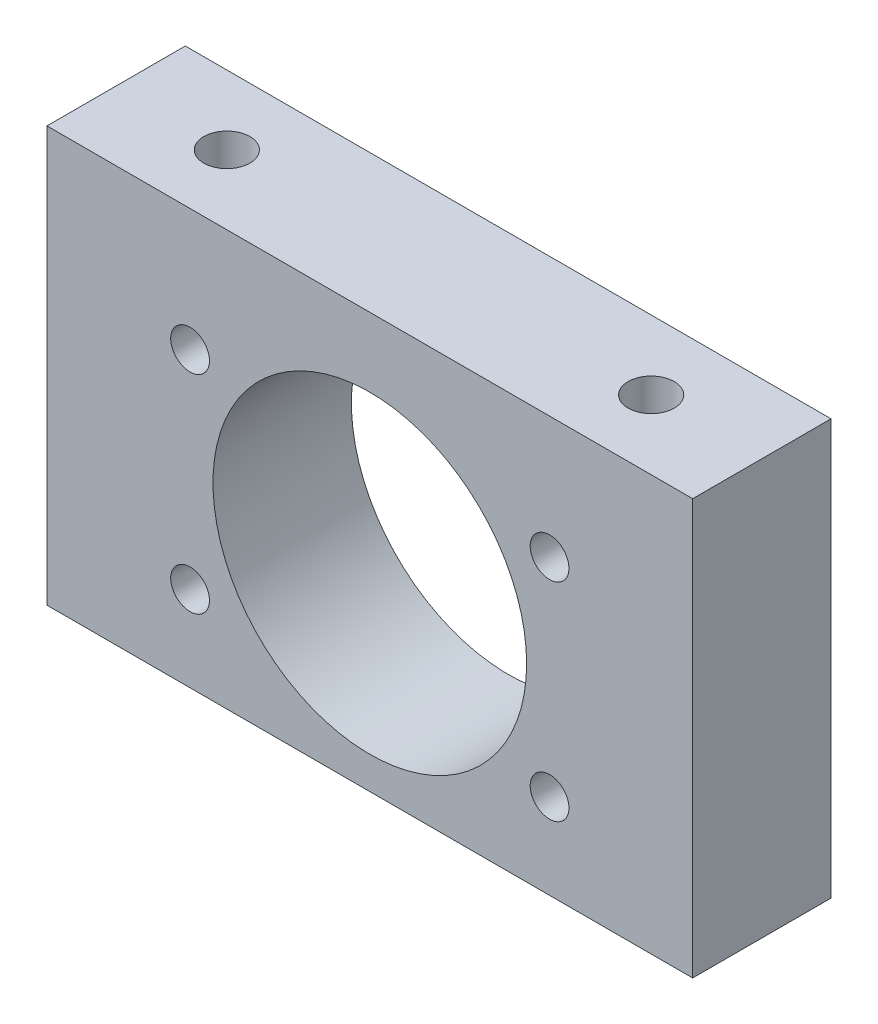
ISO-10303-21;
HEADER;
FILE_DESCRIPTION(('STEP AP214'),'2;1');
FILE_NAME('part.step','',(''),(''),'','','');
FILE_SCHEMA(('AUTOMOTIVE_DESIGN { 1 0 10303 214 1 1 1 1 }'));
ENDSEC;
DATA;
#1=APPLICATION_CONTEXT('core data for automotive mechanical design processes');
#2=APPLICATION_PROTOCOL_DEFINITION('international standard','automotive_design',2000,#1);
#3=PRODUCT_CONTEXT('',#1,'mechanical');
#4=PRODUCT('Part','Part','',(#3));
#5=PRODUCT_RELATED_PRODUCT_CATEGORY('part','',(#4));
#6=PRODUCT_DEFINITION_FORMATION('','',#4);
#7=PRODUCT_DEFINITION_CONTEXT('part definition',#1,'design');
#8=PRODUCT_DEFINITION('design','',#6,#7);
#9=PRODUCT_DEFINITION_SHAPE('','',#8);
#10=(LENGTH_UNIT() NAMED_UNIT(*) SI_UNIT(.MILLI.,.METRE.));
#11=(NAMED_UNIT(*) PLANE_ANGLE_UNIT() SI_UNIT($,.RADIAN.));
#12=(NAMED_UNIT(*) SI_UNIT($,.STERADIAN.) SOLID_ANGLE_UNIT());
#13=UNCERTAINTY_MEASURE_WITH_UNIT(LENGTH_MEASURE(1.E-05),#10,'distance_accuracy_value','');
#14=(GEOMETRIC_REPRESENTATION_CONTEXT(3) GLOBAL_UNCERTAINTY_ASSIGNED_CONTEXT((#13)) GLOBAL_UNIT_ASSIGNED_CONTEXT((#10,
#11,#12)) REPRESENTATION_CONTEXT('',''));
#15=CARTESIAN_POINT('',(0.,0.,0.));
#16=DIRECTION('',(0.,0.,1.));
#17=DIRECTION('',(1.,0.,0.));
#18=AXIS2_PLACEMENT_3D('',#15,#16,#17);
#19=CARTESIAN_POINT('',(0.,0.,15.));
#20=DIRECTION('',(1.,0.,0.));
#21=DIRECTION('',(0.,0.,-1.));
#22=AXIS2_PLACEMENT_3D('',#19,#20,#21);
#23=PLANE('',#22);
#24=DIRECTION('',(0.,-1.,0.));
#25=VECTOR('',#24,1.);
#26=CARTESIAN_POINT('',(0.,0.,0.));
#27=LINE('',#26,#25);
#28=CARTESIAN_POINT('',(0.,45.,0.));
#29=VERTEX_POINT('',#28);
#30=CARTESIAN_POINT('',(0.,0.,0.));
#31=VERTEX_POINT('',#30);
#32=EDGE_CURVE('E187',#29,#31,#27,.T.);
#33=ORIENTED_EDGE('',*,*,#32,.T.);
#34=DIRECTION('',(0.,0.,-1.));
#35=VECTOR('',#34,1.);
#36=CARTESIAN_POINT('',(0.,0.,15.));
#37=LINE('',#36,#35);
#38=CARTESIAN_POINT('',(0.,0.,15.));
#39=VERTEX_POINT('',#38);
#40=EDGE_CURVE('E190',#39,#31,#37,.T.);
#41=ORIENTED_EDGE('',*,*,#40,.F.);
#42=DIRECTION('',(0.,-1.,0.));
#43=VECTOR('',#42,1.);
#44=CARTESIAN_POINT('',(0.,0.,15.));
#45=LINE('',#44,#43);
#46=CARTESIAN_POINT('',(0.,45.,15.));
#47=VERTEX_POINT('',#46);
#48=EDGE_CURVE('E210',#47,#39,#45,.T.);
#49=ORIENTED_EDGE('',*,*,#48,.F.);
#50=DIRECTION('',(0.,0.,-1.));
#51=VECTOR('',#50,1.);
#52=CARTESIAN_POINT('',(0.,45.,15.));
#53=LINE('',#52,#51);
#54=EDGE_CURVE('E192',#47,#29,#53,.T.);
#55=ORIENTED_EDGE('',*,*,#54,.T.);
#56=EDGE_LOOP('',(#33,#41,#49,#55));
#57=FACE_BOUND('',#56,.T.);
#58=ADVANCED_FACE('F35',(#57),#23,.F.);
#59=CARTESIAN_POINT('',(0.,0.,15.));
#60=DIRECTION('',(0.,1.,0.));
#61=DIRECTION('',(0.,0.,1.));
#62=AXIS2_PLACEMENT_3D('',#59,#60,#61);
#63=PLANE('',#62);
#64=DIRECTION('',(1.,0.,0.));
#65=VECTOR('',#64,1.);
#66=CARTESIAN_POINT('',(0.,0.,0.));
#67=LINE('',#66,#65);
#68=CARTESIAN_POINT('',(70.,0.,0.));
#69=VERTEX_POINT('',#68);
#70=EDGE_CURVE('E195',#31,#69,#67,.T.);
#71=ORIENTED_EDGE('',*,*,#70,.T.);
#72=DIRECTION('',(0.,0.,-1.));
#73=VECTOR('',#72,1.);
#74=CARTESIAN_POINT('',(70.,0.,15.));
#75=LINE('',#74,#73);
#76=CARTESIAN_POINT('',(70.,0.,15.));
#77=VERTEX_POINT('',#76);
#78=EDGE_CURVE('E215',#77,#69,#75,.T.);
#79=ORIENTED_EDGE('',*,*,#78,.F.);
#80=DIRECTION('',(1.,0.,0.));
#81=VECTOR('',#80,1.);
#82=CARTESIAN_POINT('',(0.,0.,15.));
#83=LINE('',#82,#81);
#84=EDGE_CURVE('E238',#39,#77,#83,.T.);
#85=ORIENTED_EDGE('',*,*,#84,.F.);
#86=ORIENTED_EDGE('',*,*,#40,.T.);
#87=EDGE_LOOP('',(#71,#79,#85,#86));
#88=FACE_BOUND('',#87,.T.);
#89=ADVANCED_FACE('F176',(#88),#63,.F.);
#90=CARTESIAN_POINT('',(70.,0.,15.));
#91=DIRECTION('',(-1.,0.,0.));
#92=DIRECTION('',(0.,0.,1.));
#93=AXIS2_PLACEMENT_3D('',#90,#91,#92);
#94=PLANE('',#93);
#95=DIRECTION('',(0.,1.,0.));
#96=VECTOR('',#95,1.);
#97=CARTESIAN_POINT('',(70.,0.,0.));
#98=LINE('',#97,#96);
#99=CARTESIAN_POINT('',(70.,45.,0.));
#100=VERTEX_POINT('',#99);
#101=EDGE_CURVE('E198',#69,#100,#98,.T.);
#102=ORIENTED_EDGE('',*,*,#101,.T.);
#103=DIRECTION('',(0.,0.,-1.));
#104=VECTOR('',#103,1.);
#105=CARTESIAN_POINT('',(70.,45.,15.));
#106=LINE('',#105,#104);
#107=CARTESIAN_POINT('',(70.,45.,15.));
#108=VERTEX_POINT('',#107);
#109=EDGE_CURVE('E212',#108,#100,#106,.T.);
#110=ORIENTED_EDGE('',*,*,#109,.F.);
#111=DIRECTION('',(0.,1.,0.));
#112=VECTOR('',#111,1.);
#113=CARTESIAN_POINT('',(70.,0.,15.));
#114=LINE('',#113,#112);
#115=EDGE_CURVE('E239',#77,#108,#114,.T.);
#116=ORIENTED_EDGE('',*,*,#115,.F.);
#117=ORIENTED_EDGE('',*,*,#78,.T.);
#118=EDGE_LOOP('',(#102,#110,#116,#117));
#119=FACE_BOUND('',#118,.T.);
#120=ADVANCED_FACE('F181',(#119),#94,.F.);
#121=CARTESIAN_POINT('',(0.,45.,15.));
#122=DIRECTION('',(0.,-1.,0.));
#123=DIRECTION('',(0.,0.,-1.));
#124=AXIS2_PLACEMENT_3D('',#121,#122,#123);
#125=PLANE('',#124);
#126=CARTESIAN_POINT('',(12.,45.,7.49999999999999));
#127=DIRECTION('',(0.,1.,0.));
#128=DIRECTION('',(0.,0.,1.));
#129=AXIS2_PLACEMENT_3D('',#126,#127,#128);
#130=CIRCLE('',#129,2.5);
#131=CARTESIAN_POINT('',(12.,45.,9.99999999999999));
#132=VERTEX_POINT('',#131);
#133=EDGE_CURVE('E222',#132,#132,#130,.T.);
#134=ORIENTED_EDGE('',*,*,#133,.F.);
#135=EDGE_LOOP('',(#134));
#136=FACE_BOUND('',#135,.T.);
#137=CARTESIAN_POINT('',(58.,45.,7.49999999999999));
#138=DIRECTION('',(0.,1.,0.));
#139=DIRECTION('',(0.,0.,1.));
#140=AXIS2_PLACEMENT_3D('',#137,#138,#139);
#141=CIRCLE('',#140,2.5);
#142=CARTESIAN_POINT('',(58.,45.,9.99999999999999));
#143=VERTEX_POINT('',#142);
#144=EDGE_CURVE('E221',#143,#143,#141,.T.);
#145=ORIENTED_EDGE('',*,*,#144,.F.);
#146=EDGE_LOOP('',(#145));
#147=FACE_BOUND('',#146,.T.);
#148=DIRECTION('',(-1.,0.,0.));
#149=VECTOR('',#148,1.);
#150=CARTESIAN_POINT('',(0.,45.,0.));
#151=LINE('',#150,#149);
#152=EDGE_CURVE('E208',#100,#29,#151,.T.);
#153=ORIENTED_EDGE('',*,*,#152,.T.);
#154=ORIENTED_EDGE('',*,*,#54,.F.);
#155=DIRECTION('',(-1.,0.,0.));
#156=VECTOR('',#155,1.);
#157=CARTESIAN_POINT('',(0.,45.,15.));
#158=LINE('',#157,#156);
#159=EDGE_CURVE('E204',#108,#47,#158,.T.);
#160=ORIENTED_EDGE('',*,*,#159,.F.);
#161=ORIENTED_EDGE('',*,*,#109,.T.);
#162=EDGE_LOOP('',(#153,#154,#160,#161));
#163=FACE_BOUND('',#162,.T.);
#164=ADVANCED_FACE('F246',(#136,#147,#163),#125,.F.);
#165=CARTESIAN_POINT('',(0.,45.,15.));
#166=DIRECTION('',(0.,0.,-1.));
#167=DIRECTION('',(-1.,0.,0.));
#168=AXIS2_PLACEMENT_3D('',#165,#166,#167);
#169=PLANE('',#168);
#170=CARTESIAN_POINT('',(54.4855715851501,31.75,15.));
#171=DIRECTION('',(0.,0.,1.));
#172=DIRECTION('',(1.,0.,0.));
#173=AXIS2_PLACEMENT_3D('',#170,#171,#172);
#174=CIRCLE('',#173,2.1);
#175=CARTESIAN_POINT('',(56.5855715851501,31.75,15.));
#176=VERTEX_POINT('',#175);
#177=EDGE_CURVE('E116',#176,#176,#174,.T.);
#178=ORIENTED_EDGE('',*,*,#177,.F.);
#179=EDGE_LOOP('',(#178));
#180=FACE_BOUND('',#179,.T.);
#181=CARTESIAN_POINT('',(15.5144284148504,31.75,15.));
#182=DIRECTION('',(0.,0.,1.));
#183=DIRECTION('',(1.,0.,0.));
#184=AXIS2_PLACEMENT_3D('',#181,#182,#183);
#185=CIRCLE('',#184,2.1);
#186=CARTESIAN_POINT('',(17.6144284148504,31.75,15.));
#187=VERTEX_POINT('',#186);
#188=EDGE_CURVE('E118',#187,#187,#185,.T.);
#189=ORIENTED_EDGE('',*,*,#188,.F.);
#190=EDGE_LOOP('',(#189));
#191=FACE_BOUND('',#190,.T.);
#192=CARTESIAN_POINT('',(54.4855715851501,9.24999999999993,15.));
#193=DIRECTION('',(0.,0.,1.));
#194=DIRECTION('',(1.,0.,0.));
#195=AXIS2_PLACEMENT_3D('',#192,#193,#194);
#196=CIRCLE('',#195,2.1);
#197=CARTESIAN_POINT('',(56.5855715851501,9.24999999999993,15.));
#198=VERTEX_POINT('',#197);
#199=EDGE_CURVE('E155',#198,#198,#196,.T.);
#200=ORIENTED_EDGE('',*,*,#199,.F.);
#201=EDGE_LOOP('',(#200));
#202=FACE_BOUND('',#201,.T.);
#203=CARTESIAN_POINT('',(15.5144284148504,9.24999999999994,15.));
#204=DIRECTION('',(0.,0.,1.));
#205=DIRECTION('',(1.,0.,0.));
#206=AXIS2_PLACEMENT_3D('',#203,#204,#205);
#207=CIRCLE('',#206,2.1);
#208=CARTESIAN_POINT('',(17.6144284148504,9.24999999999994,15.));
#209=VERTEX_POINT('',#208);
#210=EDGE_CURVE('E411',#209,#209,#207,.T.);
#211=ORIENTED_EDGE('',*,*,#210,.F.);
#212=EDGE_LOOP('',(#211));
#213=FACE_BOUND('',#212,.T.);
#214=CARTESIAN_POINT('',(35.,20.5,15.));
#215=DIRECTION('',(0.,0.,1.));
#216=DIRECTION('',(1.,0.,0.));
#217=AXIS2_PLACEMENT_3D('',#214,#215,#216);
#218=CIRCLE('',#217,17.);
#219=CARTESIAN_POINT('',(52.,20.5,15.));
#220=VERTEX_POINT('',#219);
#221=EDGE_CURVE('E201',#220,#220,#218,.T.);
#222=ORIENTED_EDGE('',*,*,#221,.F.);
#223=EDGE_LOOP('',(#222));
#224=FACE_BOUND('',#223,.T.);
#225=ORIENTED_EDGE('',*,*,#48,.T.);
#226=ORIENTED_EDGE('',*,*,#84,.T.);
#227=ORIENTED_EDGE('',*,*,#115,.T.);
#228=ORIENTED_EDGE('',*,*,#159,.T.);
#229=EDGE_LOOP('',(#225,#226,#227,#228));
#230=FACE_BOUND('',#229,.T.);
#231=ADVANCED_FACE('F244',(#180,#191,#202,#213,#224,#230),#169,.F.);
#232=CARTESIAN_POINT('',(0.,45.,0.));
#233=DIRECTION('',(0.,0.,-1.));
#234=DIRECTION('',(-1.,0.,0.));
#235=AXIS2_PLACEMENT_3D('',#232,#233,#234);
#236=PLANE('',#235);
#237=CARTESIAN_POINT('',(35.,20.5,0.));
#238=DIRECTION('',(0.,0.,1.));
#239=DIRECTION('',(1.,0.,0.));
#240=AXIS2_PLACEMENT_3D('',#237,#238,#239);
#241=CIRCLE('',#240,17.);
#242=CARTESIAN_POINT('',(52.,20.5,0.));
#243=VERTEX_POINT('',#242);
#244=EDGE_CURVE('E196',#243,#243,#241,.T.);
#245=ORIENTED_EDGE('',*,*,#244,.T.);
#246=EDGE_LOOP('',(#245));
#247=FACE_BOUND('',#246,.T.);
#248=ORIENTED_EDGE('',*,*,#32,.F.);
#249=ORIENTED_EDGE('',*,*,#152,.F.);
#250=ORIENTED_EDGE('',*,*,#101,.F.);
#251=ORIENTED_EDGE('',*,*,#70,.F.);
#252=EDGE_LOOP('',(#248,#249,#250,#251));
#253=FACE_BOUND('',#252,.T.);
#254=ADVANCED_FACE('F248',(#247,#253),#236,.T.);
#255=CARTESIAN_POINT('',(35.,20.5,0.));
#256=DIRECTION('',(0.,0.,1.));
#257=DIRECTION('',(1.,0.,0.));
#258=AXIS2_PLACEMENT_3D('',#255,#256,#257);
#259=CYLINDRICAL_SURFACE('',#258,17.);
#260=ORIENTED_EDGE('',*,*,#244,.F.);
#261=EDGE_LOOP('',(#260));
#262=FACE_BOUND('',#261,.T.);
#263=ORIENTED_EDGE('',*,*,#221,.T.);
#264=EDGE_LOOP('',(#263));
#265=FACE_BOUND('',#264,.T.);
#266=ADVANCED_FACE('F261',(#262,#265),#259,.F.);
#267=CARTESIAN_POINT('',(58.,30.,7.49999999999999));
#268=DIRECTION('',(0.,1.,0.));
#269=DIRECTION('',(0.,0.,1.));
#270=AXIS2_PLACEMENT_3D('',#267,#268,#269);
#271=CONICAL_SURFACE('',#270,2.5,1.02974425867665);
#272=CARTESIAN_POINT('',(58.,28.4978484524311,7.49999999999999));
#273=VERTEX_POINT('',#272);
#274=VERTEX_LOOP('',#273);
#275=FACE_BOUND('',#274,.T.);
#276=CARTESIAN_POINT('',(58.,30.,7.49999999999999));
#277=DIRECTION('',(0.,1.,0.));
#278=DIRECTION('',(0.,0.,1.));
#279=AXIS2_PLACEMENT_3D('',#276,#277,#278);
#280=CIRCLE('',#279,2.5);
#281=CARTESIAN_POINT('',(55.6463902617745,30.,8.3429241959572));
#282=VERTEX_POINT('',#281);
#283=CARTESIAN_POINT('',(55.6463902617745,30.,6.65707580404279));
#284=VERTEX_POINT('',#283);
#285=EDGE_CURVE('E225',#282,#284,#280,.T.);
#286=ORIENTED_EDGE('',*,*,#285,.T.);
#287=CARTESIAN_POINT('',(56.5247346540092,31.2481893000333,3.16691846711708));
#288=CARTESIAN_POINT('',(56.5106826946843,31.1910309915306,3.27223144957305));
#289=CARTESIAN_POINT('',(56.4942506055304,31.1346680763963,3.37765367558395));
#290=CARTESIAN_POINT('',(56.4569472418074,31.024002445093,3.58878460363518));
#291=CARTESIAN_POINT('',(56.4360762813703,30.9696995834574,3.69449328488115));
#292=CARTESIAN_POINT('',(56.3901986768494,30.8635794134962,3.9063515403604));
#293=CARTESIAN_POINT('',(56.3651892479476,30.8117638093683,4.01250136423183));
#294=CARTESIAN_POINT('',(56.3115390751817,30.7112084530435,4.22533637691594));
#295=CARTESIAN_POINT('',(56.2828983800424,30.6624686595881,4.33202155852667));
#296=CARTESIAN_POINT('',(56.2227543905059,30.5687779571738,4.5458962108301));
#297=CARTESIAN_POINT('',(56.1912586553484,30.5238176171977,4.65308367623974));
#298=CARTESIAN_POINT('',(56.1262807663115,30.4381453205626,4.86856279207873));
#299=CARTESIAN_POINT('',(56.0927984482949,30.3974337157153,4.97685453313268));
#300=CARTESIAN_POINT('',(56.0251228565287,30.3208784195247,5.1947564834574));
#301=CARTESIAN_POINT('',(55.9909305747594,30.2850284021897,5.3043647733368));
#302=CARTESIAN_POINT('',(55.9233057421567,30.2186066782857,5.52538437865022));
#303=CARTESIAN_POINT('',(55.8898729839643,30.1880335156606,5.63679518740037));
#304=CARTESIAN_POINT('',(55.8428210999614,30.1474201447143,5.80118195542093));
#305=CARTESIAN_POINT('',(55.8282213993926,30.1351841456196,5.85334012583731));
#306=CARTESIAN_POINT('',(55.7997342873352,30.111917568504,5.9581155065271));
#307=CARTESIAN_POINT('',(55.7858468507937,30.1008869480702,6.01073270057876));
#308=CARTESIAN_POINT('',(55.7455083749476,30.0696080583523,6.16935418979649));
#309=CARTESIAN_POINT('',(55.7203972295957,30.0511863202394,6.27607364539102));
#310=CARTESIAN_POINT('',(55.6740401516861,30.0184131856814,6.49669287483828));
#311=CARTESIAN_POINT('',(55.6530507276536,30.0043117964712,6.61068460807968));
#312=CARTESIAN_POINT('',(55.6180070214565,29.981375618145,6.8402927434104));
#313=CARTESIAN_POINT('',(55.6039538141984,29.9725416452771,6.95590939445999));
#314=CARTESIAN_POINT('',(55.5838169700203,29.9600276242852,7.1880483733203));
#315=CARTESIAN_POINT('',(55.5777280249176,29.9563441432441,7.30457004577715));
#316=CARTESIAN_POINT('',(55.5739566646824,29.9540543908998,7.53776837854316));
#317=CARTESIAN_POINT('',(55.5762721688698,29.955446862949,7.65444499334409));
#318=CARTESIAN_POINT('',(55.5906054140037,29.9642239550863,7.91352069245029));
#319=CARTESIAN_POINT('',(55.6047007909217,29.97289365959,8.05576368443222));
#320=CARTESIAN_POINT('',(55.6437518908492,29.9981034497462,8.3379503527768));
#321=CARTESIAN_POINT('',(55.6687033193803,30.0146404234757,8.47789491566695));
#322=CARTESIAN_POINT('',(55.7087684641241,30.0429650285768,8.66858869682864));
#323=CARTESIAN_POINT('',(55.7203412322942,30.0513038629587,8.72064828880954));
#324=CARTESIAN_POINT('',(55.7445018070699,30.0691309337428,8.82432676231467));
#325=CARTESIAN_POINT('',(55.7570894537561,30.0786189891744,8.87594571186094));
#326=CARTESIAN_POINT('',(55.7966209594451,30.1091861806832,9.03206422208381));
#327=CARTESIAN_POINT('',(55.8249115990471,30.1320791839824,9.13587198009755));
#328=CARTESIAN_POINT('',(55.8836345792849,30.18254410795,9.34174416342121));
#329=CARTESIAN_POINT('',(55.914067557527,30.2101174250563,9.44380805839224));
#330=CARTESIAN_POINT('',(55.9757862809941,30.2697620411561,9.64655641888615));
#331=CARTESIAN_POINT('',(56.0070734321235,30.3018411670758,9.74723814208406));
#332=CARTESIAN_POINT('',(56.0692597107854,30.3701214861935,9.94731669655812));
#333=CARTESIAN_POINT('',(56.1001588162031,30.4063229131491,10.0467134546133));
#334=CARTESIAN_POINT('',(56.1606350012503,30.4825090279352,10.2447144281598));
#335=CARTESIAN_POINT('',(56.1902091253948,30.5225016083313,10.3433165050975));
#336=CARTESIAN_POINT('',(56.2471702487661,30.6057465937836,10.5397754777592));
#337=CARTESIAN_POINT('',(56.2745572027592,30.6489990662228,10.6376323580337));
#338=CARTESIAN_POINT('',(56.3264674852986,30.7381923291466,10.83258286293));
#339=CARTESIAN_POINT('',(56.3509974509101,30.7841265010303,10.9296777472646));
#340=CARTESIAN_POINT('',(56.39685158803,30.878349952752,11.1234840773021));
#341=CARTESIAN_POINT('',(56.4181756687167,30.9266392992601,11.2201955120664));
#342=CARTESIAN_POINT('',(56.4376875601483,30.97589198418,11.3167854082431));
#343=B_SPLINE_CURVE_WITH_KNOTS('',3,(#287,#288,#289,#290,#291,#292,#293,#294,#295,#296,#297,
#298,#299,#300,#301,#302,#303,#304,#305,#306,#307,#308,#309,#310,#311,#312,#313,#314,#315,#316,
#317,#318,#319,#320,#321,#322,#323,#324,#325,#326,#327,#328,#329,#330,#331,#332,#333,#334,#335,
#336,#337,#338,#339,#340,#341,#342),.UNSPECIFIED.,.F.,.F.,(4,2,2,2,2,2,2,2,2,2,2,2,2,2,2,2,2,2,
2,2,2,2,2,2,2,2,2,4),(0.,0.361904973918611,0.723784344897329,1.08590822591481,1.4480272484095,
1.80921403806793,2.17043071169332,2.53117275831296,2.89181510476068,3.05838171025002,
3.2249424529798,3.55823962534504,3.90822621773219,4.25826703057002,4.60807442203718,
4.95779521798275,5.38668210400796,5.81539948335972,5.97731929226745,6.13921363636969,
6.46905089975781,6.79898674829461,7.12950297574056,7.46003795464668,7.79127683298387,
8.1225225600188,8.45298273755217,8.78345227515216),.UNSPECIFIED.);
#344=EDGE_CURVE('E11',#284,#282,#343,.T.);
#345=ORIENTED_EDGE('',*,*,#344,.T.);
#346=EDGE_LOOP('',(#286,#345));
#347=FACE_BOUND('',#346,.T.);
#348=ADVANCED_FACE('F172',(#275,#347),#271,.F.);
#349=CARTESIAN_POINT('',(58.,45.,7.49999999999999));
#350=DIRECTION('',(0.,1.,0.));
#351=DIRECTION('',(0.,0.,1.));
#352=AXIS2_PLACEMENT_3D('',#349,#350,#351);
#353=CYLINDRICAL_SURFACE('',#352,2.5);
#354=ORIENTED_EDGE('',*,*,#285,.F.);
#355=CARTESIAN_POINT('',(55.6463902617745,30.,8.34292419595721));
#356=CARTESIAN_POINT('',(55.6630791001433,30.0110792131816,8.38955317319804));
#357=CARTESIAN_POINT('',(55.6810850777669,30.023358345515,8.43543461889436));
#358=CARTESIAN_POINT('',(55.7194547725428,30.0505605431524,8.52542394743995));
#359=CARTESIAN_POINT('',(55.7398198327364,30.0654851171123,8.56953080056087));
#360=CARTESIAN_POINT('',(55.7826710495553,30.0982557744871,8.65575842193369));
#361=CARTESIAN_POINT('',(55.8051629613441,30.1161098868405,8.69787331031544));
#362=CARTESIAN_POINT('',(55.8518137536535,30.1549122297359,8.77965544700928));
#363=CARTESIAN_POINT('',(55.8759722934364,30.1758598288155,8.81932319251051));
#364=CARTESIAN_POINT('',(55.9505334979864,30.2438745059405,8.93458541418534));
#365=CARTESIAN_POINT('',(56.0028497234199,30.2959902966857,9.00610103977678));
#366=CARTESIAN_POINT('',(56.1077391385114,30.4140489645769,9.13594938512807));
#367=CARTESIAN_POINT('',(56.1603113378643,30.4799563821966,9.19431513034967));
#368=CARTESIAN_POINT('',(56.2570215249573,30.6192477315236,9.29345243188869));
#369=CARTESIAN_POINT('',(56.301496650789,30.6916904433394,9.3352201809891));
#370=CARTESIAN_POINT('',(56.382997903955,30.8459075856895,9.40742910407901));
#371=CARTESIAN_POINT('',(56.4200173898963,30.9276902354106,9.43786019983813));
#372=CARTESIAN_POINT('',(56.4831256110043,31.0960367936096,9.48763051184369));
#373=CARTESIAN_POINT('',(56.5094596140038,31.1824347743618,9.50722288156735));
#374=CARTESIAN_POINT('',(56.5509224337948,31.3593766206719,9.53735945727443));
#375=CARTESIAN_POINT('',(56.5660516843384,31.4499203255987,9.54790401351416));
#376=CARTESIAN_POINT('',(56.5846518578863,31.6362115756846,9.56080749130401));
#377=CARTESIAN_POINT('',(56.5876659536265,31.7320271392003,9.56284577087216));
#378=CARTESIAN_POINT('',(56.5806162793737,31.9229686330731,9.55800056055726));
#379=CARTESIAN_POINT('',(56.5705495614273,32.0180944031162,9.55111505957013));
#380=CARTESIAN_POINT('',(56.5375972265776,32.2066148467167,9.52775550698444));
#381=CARTESIAN_POINT('',(56.5144948160612,32.2999518892292,9.51111910414508));
#382=CARTESIAN_POINT('',(56.456760897151,32.4803213823777,9.46716042998792));
#383=CARTESIAN_POINT('',(56.4221334894459,32.5673560620542,9.43984195883419));
#384=CARTESIAN_POINT('',(56.3448432352196,32.7303238244675,9.3742848052982));
#385=CARTESIAN_POINT('',(56.3024071274657,32.8064829398924,9.3363414960305));
#386=CARTESIAN_POINT('',(56.2122722081561,32.9481459527682,9.24870242019299));
#387=CARTESIAN_POINT('',(56.1645753804448,33.0136538439489,9.19901107583809));
#388=CARTESIAN_POINT('',(56.0693712194113,33.1309857456757,9.08988657948618));
#389=CARTESIAN_POINT('',(56.0219049254263,33.1831747132773,9.03080814106018));
#390=CARTESIAN_POINT('',(55.9292507064774,33.276474883542,8.90293678352434));
#391=CARTESIAN_POINT('',(55.8840634826692,33.317582693784,8.83414089928568));
#392=CARTESIAN_POINT('',(55.7969958288223,33.3912117957209,8.68513795731653));
#393=CARTESIAN_POINT('',(55.7553609359794,33.4232547578093,8.60455305840324));
#394=CARTESIAN_POINT('',(55.6802523465767,33.477684389308,8.43661668248966));
#395=CARTESIAN_POINT('',(55.6467828048138,33.5000661472201,8.34926179035922));
#396=CARTESIAN_POINT('',(55.5859286720176,33.5390481927855,8.15841894526017));
#397=CARTESIAN_POINT('',(55.5598540208985,33.5545553445296,8.05428993095641));
#398=CARTESIAN_POINT('',(55.5212518960999,33.5769811350841,7.84263872903644));
#399=CARTESIAN_POINT('',(55.5087317671117,33.5838951178759,7.735114734248));
#400=CARTESIAN_POINT('',(55.4971456081812,33.5903203944636,7.50752378894653));
#401=CARTESIAN_POINT('',(55.4996678495553,33.5889575025284,7.38734925965005));
#402=CARTESIAN_POINT('',(55.5218785225255,33.5765365590956,7.14897040788802));
#403=CARTESIAN_POINT('',(55.5415751647954,33.5654738703409,7.03076705534527));
#404=CARTESIAN_POINT('',(55.5834663018259,33.5402178508252,6.85652906757059));
#405=CARTESIAN_POINT('',(55.5997203379295,33.5302065764086,6.79838125933901));
#406=CARTESIAN_POINT('',(55.63615455185,33.5068812419805,6.68401802165461));
#407=CARTESIAN_POINT('',(55.6563329245726,33.4935686996961,6.62780171769522));
#408=CARTESIAN_POINT('',(55.7002483882269,33.463262923373,6.51783507774355));
#409=CARTESIAN_POINT('',(55.7239837463397,33.446271479763,6.46408355756899));
#410=CARTESIAN_POINT('',(55.7745230984945,33.4081931359184,6.35955264594312));
#411=CARTESIAN_POINT('',(55.8013266645368,33.387106806615,6.30877284144201));
#412=CARTESIAN_POINT('',(55.8549708117543,33.3424374610809,6.21488487412797));
#413=CARTESIAN_POINT('',(55.8816150329779,33.3192184265524,6.17149141379662));
#414=CARTESIAN_POINT('',(55.9363198241074,33.2687869318265,6.08801024820701));
#415=CARTESIAN_POINT('',(55.9643808767349,33.2415731044772,6.04792368204423));
#416=CARTESIAN_POINT('',(56.0211497980539,33.1830581518647,5.9714663060578));
#417=CARTESIAN_POINT('',(56.049856654306,33.1517630993498,5.93509011584845));
#418=CARTESIAN_POINT('',(56.107166309948,33.085054385307,5.86623398512623));
#419=CARTESIAN_POINT('',(56.1357690760162,33.0496395072221,5.83375520127265));
#420=CARTESIAN_POINT('',(56.2124287550225,32.9476830437989,5.7508050661316));
#421=CARTESIAN_POINT('',(56.259598467363,32.8771501987886,5.70430408409597));
#422=CARTESIAN_POINT('',(56.3471647566883,32.7257684458409,5.6233745536043));
#423=CARTESIAN_POINT('',(56.3875607512283,32.644918651842,5.58894704301995));
#424=CARTESIAN_POINT('',(56.4568368856123,32.4792480263478,5.53262830542317));
#425=CARTESIAN_POINT('',(56.4861639419141,32.3947848556739,5.51023005495183));
#426=CARTESIAN_POINT('',(56.5340542598994,32.2210069667422,5.47468583147919));
#427=CARTESIAN_POINT('',(56.5526161663603,32.1316916391946,5.46154102334745));
#428=CARTESIAN_POINT('',(56.5784054474392,31.947463938672,5.44346647068318));
#429=CARTESIAN_POINT('',(56.5852214019895,31.8524646999455,5.4388345516372));
#430=CARTESIAN_POINT('',(56.5858955085886,31.662387308871,5.4383726490535));
#431=CARTESIAN_POINT('',(56.579751312516,31.5673091453431,5.44254426054036));
#432=CARTESIAN_POINT('',(56.5545371258878,31.3775098982923,5.46017647056294));
#433=CARTESIAN_POINT('',(56.5351746717497,31.2828467345112,5.47384737259369));
#434=CARTESIAN_POINT('',(56.4843830945373,31.0989675647993,5.51155873765185));
#435=CARTESIAN_POINT('',(56.4529552711976,31.0097509733392,5.53559808377927));
#436=CARTESIAN_POINT('',(56.3809153277089,30.8412068385989,5.59456652565834));
#437=CARTESIAN_POINT('',(56.3404947122254,30.761720100195,5.62927360721669));
#438=CARTESIAN_POINT('',(56.2532594010455,30.6130293350713,5.7104683412076));
#439=CARTESIAN_POINT('',(56.2064511016986,30.5438151647825,5.75694424818587));
#440=CARTESIAN_POINT('',(56.1120362349506,30.419396693668,5.85979229505964));
#441=CARTESIAN_POINT('',(56.0645193464322,30.3637771385771,5.91574705611625));
#442=CARTESIAN_POINT('',(55.9706595921802,30.2636482562411,6.03791187613169));
#443=CARTESIAN_POINT('',(55.9243189087979,30.2191583928041,6.10413957751831));
#444=CARTESIAN_POINT('',(55.8575183320545,30.1598147390871,6.21095939067307));
#445=CARTESIAN_POINT('',(55.8353959641479,30.1410449438667,6.24842818181014));
#446=CARTESIAN_POINT('',(55.7926685006071,30.1061456187567,6.32542679488378));
#447=CARTESIAN_POINT('',(55.7720636846156,30.0900165748179,6.36495699439974));
#448=CARTESIAN_POINT('',(55.7327315432646,30.0602659381754,6.44572026307687));
#449=CARTESIAN_POINT('',(55.7140000374599,30.0466387029407,6.48694923693758));
#450=CARTESIAN_POINT('',(55.6785970328505,30.0216618597817,6.5709286673878));
#451=CARTESIAN_POINT('',(55.6619245425711,30.0103111539873,6.61367837882429));
#452=CARTESIAN_POINT('',(55.6463902617745,30.,6.65707580404278));
#453=B_SPLINE_CURVE_WITH_KNOTS('',3,(#355,#356,#357,#358,#359,#360,#361,#362,#363,#364,#365,
#366,#367,#368,#369,#370,#371,#372,#373,#374,#375,#376,#377,#378,#379,#380,#381,#382,#383,#384,
#385,#386,#387,#388,#389,#390,#391,#392,#393,#394,#395,#396,#397,#398,#399,#400,#401,#402,#403,
#404,#405,#406,#407,#408,#409,#410,#411,#412,#413,#414,#415,#416,#417,#418,#419,#420,#421,#422,
#423,#424,#425,#426,#427,#428,#429,#430,#431,#432,#433,#434,#435,#436,#437,#438,#439,#440,#441,
#442,#443,#444,#445,#446,#447,#448,#449,#450,#451,#452),.UNSPECIFIED.,.F.,.F.,(4,2,2,2,2,2,2,2,
2,2,2,2,2,2,2,2,2,2,2,2,2,2,2,2,2,2,2,2,2,2,2,2,2,2,2,2,2,2,2,2,2,2,2,2,2,2,2,2,4),(0.,
0.152224342220604,0.30453577666436,0.457271843474789,0.609976775804813,0.916566757422442,
1.22237794617077,1.50508189467771,1.78803656926841,2.06406861754423,2.34008997966609,
2.62642684950832,2.91282826076201,3.20413939768233,3.4953469943168,3.77914904691927,
4.06284443989519,4.33763561050392,4.61251081126644,4.89994942219567,5.18753398763588,
5.51158894960195,5.83581941714673,6.19484982949909,6.55405197994913,6.73745366418356,
6.92077118702121,7.10399969357329,7.28720267173008,7.45485103847552,7.62255691445491,
7.79001603686612,7.95752473496631,8.2461502771403,8.53480062435034,8.81007424846324,
9.08538251920146,9.37015149968655,9.65497207907519,9.94630795354763,10.2376124528401,
10.5232236313168,10.8085508815508,11.0835873582781,11.359101513232,11.5011472446899,
11.643219086077,11.7849664556898,11.9266453015315),.UNSPECIFIED.);
#454=EDGE_CURVE('E53',#282,#284,#453,.T.);
#455=ORIENTED_EDGE('',*,*,#454,.T.);
#456=EDGE_LOOP('',(#354,#455));
#457=FACE_BOUND('',#456,.T.);
#458=ORIENTED_EDGE('',*,*,#144,.T.);
#459=EDGE_LOOP('',(#458));
#460=FACE_BOUND('',#459,.T.);
#461=ADVANCED_FACE('F128',(#457,#460),#353,.F.);
#462=CARTESIAN_POINT('',(12.,30.,7.49999999999999));
#463=DIRECTION('',(0.,1.,0.));
#464=DIRECTION('',(0.,0.,1.));
#465=AXIS2_PLACEMENT_3D('',#462,#463,#464);
#466=CONICAL_SURFACE('',#465,2.5,1.02974425867665);
#467=CARTESIAN_POINT('',(12.,28.4978484524311,7.49999999999999));
#468=VERTEX_POINT('',#467);
#469=VERTEX_LOOP('',#468);
#470=FACE_BOUND('',#469,.T.);
#471=CARTESIAN_POINT('',(12.,30.,7.49999999999999));
#472=DIRECTION('',(0.,1.,0.));
#473=DIRECTION('',(0.,0.,1.));
#474=AXIS2_PLACEMENT_3D('',#471,#472,#473);
#475=CIRCLE('',#474,2.5);
#476=CARTESIAN_POINT('',(14.353609738226,30.,6.65707580404418));
#477=VERTEX_POINT('',#476);
#478=CARTESIAN_POINT('',(14.353609738226,30.,8.3429241959558));
#479=VERTEX_POINT('',#478);
#480=EDGE_CURVE('E219',#477,#479,#475,.T.);
#481=ORIENTED_EDGE('',*,*,#480,.T.);
#482=CARTESIAN_POINT('',(13.562312439852,30.9758919841806,11.316785408244));
#483=CARTESIAN_POINT('',(13.5839057864947,30.9213632807148,11.2098397609063));
#484=CARTESIAN_POINT('',(13.6077339696277,30.8680120969539,11.1027506781003));
#485=CARTESIAN_POINT('',(13.6592659363611,30.7642533158289,10.8880855557671));
#486=CARTESIAN_POINT('',(13.6869695465735,30.7138455869163,10.780509538234));
#487=CARTESIAN_POINT('',(13.745786020442,30.6163489344677,10.5641986854165));
#488=CARTESIAN_POINT('',(13.7769129778975,30.5692751502532,10.4554608602875));
#489=CARTESIAN_POINT('',(13.8415723297973,30.4793240090038,10.2369705511573));
#490=CARTESIAN_POINT('',(13.8751046826476,30.4364465794357,10.1272180847298));
#491=CARTESIAN_POINT('',(13.9441733598552,30.3545673662539,9.90377496884262));
#492=CARTESIAN_POINT('',(13.979738061663,30.3156777192729,9.79005186026147));
#493=CARTESIAN_POINT('',(14.0505310723151,30.2434938547213,9.56071335211987));
#494=CARTESIAN_POINT('',(14.085759343022,30.2102002645734,9.44509774196722));
#495=CARTESIAN_POINT('',(14.1538667251346,30.1497055068557,9.21197628528185));
#496=CARTESIAN_POINT('',(14.1867524488696,30.1224866869841,9.09447700774116));
#497=CARTESIAN_POINT('',(14.2482155804774,30.0742208797029,8.85713230673678));
#498=CARTESIAN_POINT('',(14.2767947410753,30.0531713781326,8.73728786029193));
#499=CARTESIAN_POINT('',(14.3260535463877,30.0183470740793,8.50286332629308));
#500=CARTESIAN_POINT('',(14.3471141256489,30.0042010586227,8.38841979417782));
#501=CARTESIAN_POINT('',(14.3822433730792,29.9812146374716,8.15788005370627));
#502=CARTESIAN_POINT('',(14.3963099116606,29.9723758475833,8.04178335303813));
#503=CARTESIAN_POINT('',(14.4163210048547,29.9599438620718,7.80961729576007));
#504=CARTESIAN_POINT('',(14.422335073546,29.9563057521049,7.69355646776243));
#505=CARTESIAN_POINT('',(14.4260252796682,29.9540654206593,7.46129383911406));
#506=CARTESIAN_POINT('',(14.4237037990738,29.9554617605319,7.34509208822053));
#507=CARTESIAN_POINT('',(14.4094013487081,29.9642195908522,7.08663664033139));
#508=CARTESIAN_POINT('',(14.3953222754421,29.9728787208404,6.94453560503829));
#509=CARTESIAN_POINT('',(14.3660736296971,29.9917605476228,6.73298337498463));
#510=CARTESIAN_POINT('',(14.3549528887005,29.9990475874212,6.66265850061234));
#511=CARTESIAN_POINT('',(14.3303050330984,30.015619693949,6.52266284167991));
#512=CARTESIAN_POINT('',(14.3167778485159,30.0249048187823,6.45299207620264));
#513=CARTESIAN_POINT('',(14.2828225609531,30.0489097262017,6.29140035905145));
#514=CARTESIAN_POINT('',(14.2615936765301,30.0644106157359,6.19976368542837));
#515=CARTESIAN_POINT('',(14.2163468641912,30.0990003939327,6.01785827914282));
#516=CARTESIAN_POINT('',(14.192328273726,30.1180901356089,5.92758987722039));
#517=CARTESIAN_POINT('',(14.1174381914428,30.1807276340969,5.6586430977431));
#518=CARTESIAN_POINT('',(14.0637680867897,30.2296205320552,5.48197835111159));
#519=CARTESIAN_POINT('',(13.9557492364608,30.340554245962,5.1324485018333));
#520=CARTESIAN_POINT('',(13.9013988336754,30.4026379991785,4.95959789348546));
#521=CARTESIAN_POINT('',(13.7976053932194,30.5376585729157,4.61679688416748));
#522=CARTESIAN_POINT('',(13.7481595824095,30.6105892014459,4.44684488980917));
#523=CARTESIAN_POINT('',(13.6779272810132,30.7303322268892,4.18433736879235));
#524=CARTESIAN_POINT('',(13.6542229019333,30.7742143552354,4.09120637333589));
#525=CARTESIAN_POINT('',(13.6097446385188,30.8641711196938,3.90530214417261));
#526=CARTESIAN_POINT('',(13.5889706810997,30.9102457010881,3.81252890159963));
#527=CARTESIAN_POINT('',(13.550707137309,31.0041040745815,3.6274953789745));
#528=CARTESIAN_POINT('',(13.5332088436718,31.0518829215409,3.53523439027563));
#529=CARTESIAN_POINT('',(13.5016262642444,31.1489671646527,3.35092599622837));
#530=CARTESIAN_POINT('',(13.4875421455265,31.1982726353773,3.25887860155041));
#531=CARTESIAN_POINT('',(13.4752653459912,31.2481893000336,3.16691846711674));
#532=B_SPLINE_CURVE_WITH_KNOTS('',3,(#482,#483,#484,#485,#486,#487,#488,#489,#490,#491,#492,
#493,#494,#495,#496,#497,#498,#499,#500,#501,#502,#503,#504,#505,#506,#507,#508,#509,#510,#511,
#512,#513,#514,#515,#516,#517,#518,#519,#520,#521,#522,#523,#524,#525,#526,#527,#528,#529,#530,
#531),.UNSPECIFIED.,.F.,.F.,(4,2,2,2,2,2,2,2,2,2,2,2,2,2,2,2,2,2,2,2,2,2,2,2,4),(0.,
0.365881975947816,0.731747587436555,1.09918022029433,1.46660650103455,1.84250334551206,
2.21844230697731,2.59327420001807,2.9679531260495,3.31931383627707,3.67078146551508,
4.01919500667492,4.36750899277257,4.7959038705649,5.01055887469578,5.22522012180134,
5.51107686018389,5.79700162830525,6.36933206503748,6.94355483294136,7.51745105235062,
7.83433297383951,8.15120699092628,8.46722635657682,8.7832611834956),.UNSPECIFIED.);
#533=EDGE_CURVE('E47',#479,#477,#532,.T.);
#534=ORIENTED_EDGE('',*,*,#533,.T.);
#535=EDGE_LOOP('',(#481,#534));
#536=FACE_BOUND('',#535,.T.);
#537=ADVANCED_FACE('F163',(#470,#536),#466,.F.);
#538=CARTESIAN_POINT('',(12.,45.,7.49999999999999));
#539=DIRECTION('',(0.,1.,0.));
#540=DIRECTION('',(0.,0.,1.));
#541=AXIS2_PLACEMENT_3D('',#538,#539,#540);
#542=CYLINDRICAL_SURFACE('',#541,2.5);
#543=ORIENTED_EDGE('',*,*,#480,.F.);
#544=CARTESIAN_POINT('',(14.353609738226,30.,6.65707580404418));
#545=CARTESIAN_POINT('',(14.3369208998573,30.0110792131816,6.61044682680332));
#546=CARTESIAN_POINT('',(14.3189149222336,30.023358345515,6.56456538110698));
#547=CARTESIAN_POINT('',(14.2805452274578,30.0505605431524,6.47457605256136));
#548=CARTESIAN_POINT('',(14.2601801672642,30.0654851171122,6.43046919944041));
#549=CARTESIAN_POINT('',(14.2173289504453,30.098255774487,6.34424157806755));
#550=CARTESIAN_POINT('',(14.1948370386566,30.1161098868403,6.30212668968577));
#551=CARTESIAN_POINT('',(14.1481862463472,30.1549122297357,6.22034455299188));
#552=CARTESIAN_POINT('',(14.1240277065643,30.1758598288154,6.18067680749062));
#553=CARTESIAN_POINT('',(14.0494665020144,30.2438745059403,6.06541458581572));
#554=CARTESIAN_POINT('',(13.9971502765809,30.2959902966854,5.99389896022423));
#555=CARTESIAN_POINT('',(13.8922608614894,30.4140489645766,5.86405061487283));
#556=CARTESIAN_POINT('',(13.8396886621365,30.4799563821963,5.80568486965117));
#557=CARTESIAN_POINT('',(13.7429784750435,30.6192477315232,5.70654756811204));
#558=CARTESIAN_POINT('',(13.6985033492117,30.691690443339,5.66477981901159));
#559=CARTESIAN_POINT('',(13.6170020960458,30.845907585689,5.5925708959216));
#560=CARTESIAN_POINT('',(13.5799826101044,30.9276902354101,5.56213980016244));
#561=CARTESIAN_POINT('',(13.5168743889964,31.096036793609,5.51236948815682));
#562=CARTESIAN_POINT('',(13.4905403859969,31.1824347743612,5.49277711843313));
#563=CARTESIAN_POINT('',(13.4490775662058,31.3593766206712,5.46264054272599));
#564=CARTESIAN_POINT('',(13.4339483156622,31.449920325598,5.45209598648624));
#565=CARTESIAN_POINT('',(13.4153481421142,31.6362115756839,5.43919250869635));
#566=CARTESIAN_POINT('',(13.412334046374,31.7320271391995,5.43715422912817));
#567=CARTESIAN_POINT('',(13.4193837206268,31.9229686330723,5.44199943944303));
#568=CARTESIAN_POINT('',(13.4294504385731,32.0180944031155,5.44888494043014));
#569=CARTESIAN_POINT('',(13.4624027734228,32.2066148467159,5.47224449301579));
#570=CARTESIAN_POINT('',(13.4855051839391,32.2999518892284,5.48888089585512));
#571=CARTESIAN_POINT('',(13.5432391028492,32.4803213823769,5.53283957001223));
#572=CARTESIAN_POINT('',(13.5778665105543,32.5673560620534,5.56015804116594));
#573=CARTESIAN_POINT('',(13.6551567647805,32.7303238244668,5.62571519470187));
#574=CARTESIAN_POINT('',(13.6975928725344,32.8064829398917,5.66365850396955));
#575=CARTESIAN_POINT('',(13.7877277918439,32.9481459527675,5.75129757980702));
#576=CARTESIAN_POINT('',(13.8354246195552,33.0136538439482,5.80098892416188));
#577=CARTESIAN_POINT('',(13.9306287805887,33.1309857456751,5.91011342051375));
#578=CARTESIAN_POINT('',(13.9780950745736,33.1831747132767,5.96919185893972));
#579=CARTESIAN_POINT('',(14.0707492935225,33.2764748835415,6.09706321647551));
#580=CARTESIAN_POINT('',(14.1159365173307,33.3175826937835,6.16585910071416));
#581=CARTESIAN_POINT('',(14.2030041711776,33.3912117957204,6.31486204268325));
#582=CARTESIAN_POINT('',(14.2446390640205,33.4232547578088,6.39544694159652));
#583=CARTESIAN_POINT('',(14.3197476534232,33.4776843893076,6.56338331751004));
#584=CARTESIAN_POINT('',(14.3532171951861,33.5000661472197,6.65073820964045));
#585=CARTESIAN_POINT('',(14.4140713279823,33.5390481927851,6.84158105473944));
#586=CARTESIAN_POINT('',(14.4401459791014,33.5545553445292,6.94571006904317));
#587=CARTESIAN_POINT('',(14.4787481039001,33.5769811350838,7.15736127096307));
#588=CARTESIAN_POINT('',(14.4912682328882,33.5838951178756,7.26488526575148));
#589=CARTESIAN_POINT('',(14.5028543918188,33.5903203944633,7.4924762110529));
#590=CARTESIAN_POINT('',(14.5003321504447,33.5889575025281,7.61265074034935));
#591=CARTESIAN_POINT('',(14.4781214774746,33.5765365590954,7.85102959211135));
#592=CARTESIAN_POINT('',(14.4584248352047,33.5654738703407,7.96923294465407));
#593=CARTESIAN_POINT('',(14.4165336981743,33.540217850825,8.14347093242874));
#594=CARTESIAN_POINT('',(14.4002796620707,33.5302065764084,8.20161874066032));
#595=CARTESIAN_POINT('',(14.3638454481502,33.5068812419804,8.31598197834472));
#596=CARTESIAN_POINT('',(14.3436670754276,33.493568699696,8.3721982823041));
#597=CARTESIAN_POINT('',(14.2997516117733,33.4632629233729,8.48216492225578));
#598=CARTESIAN_POINT('',(14.2760162536606,33.4462714797628,8.53591644243033));
#599=CARTESIAN_POINT('',(14.2254769015059,33.4081931359182,8.64044735405622));
#600=CARTESIAN_POINT('',(14.1986733354636,33.3871068066149,8.69122715855733));
#601=CARTESIAN_POINT('',(14.1450291882461,33.3424374610808,8.78511512587138));
#602=CARTESIAN_POINT('',(14.1183849670225,33.3192184265523,8.82850858620274));
#603=CARTESIAN_POINT('',(14.063680175893,33.2687869318264,8.91198975179236));
#604=CARTESIAN_POINT('',(14.0356191232655,33.2415731044772,8.95207631795516));
#605=CARTESIAN_POINT('',(13.9788502019466,33.1830581518646,9.0285336939416));
#606=CARTESIAN_POINT('',(13.9501433456945,33.1517630993498,9.06490988415097));
#607=CARTESIAN_POINT('',(13.8928336900525,33.085054385307,9.1337660148732));
#608=CARTESIAN_POINT('',(13.8642309239843,33.0496395072221,9.1662447987268));
#609=CARTESIAN_POINT('',(13.787571244978,32.9476830437989,9.24919493386788));
#610=CARTESIAN_POINT('',(13.7404015326375,32.8771501987886,9.29569591590353));
#611=CARTESIAN_POINT('',(13.6528352433122,32.7257684458409,9.37662544639524));
#612=CARTESIAN_POINT('',(13.6124392487722,32.644918651842,9.4110529569796));
#613=CARTESIAN_POINT('',(13.5431631143882,32.4792480263478,9.46737169457641));
#614=CARTESIAN_POINT('',(13.5138360580864,32.3947848556739,9.48976994504776));
#615=CARTESIAN_POINT('',(13.4659457401011,32.2210069667423,9.52531416852042));
#616=CARTESIAN_POINT('',(13.4473838336403,32.1316916391947,9.53845897665217));
#617=CARTESIAN_POINT('',(13.4215945525613,31.9474639386721,9.55653352931645));
#618=CARTESIAN_POINT('',(13.414778598011,31.8524646999457,9.56116544836243));
#619=CARTESIAN_POINT('',(13.4141044914119,31.6623873088712,9.56162735094615));
#620=CARTESIAN_POINT('',(13.4202486874845,31.5673091453433,9.55745573945929));
#621=CARTESIAN_POINT('',(13.4454628741127,31.3775098982925,9.53982352943672));
#622=CARTESIAN_POINT('',(13.4648253282507,31.2828467345114,9.52615262740597));
#623=CARTESIAN_POINT('',(13.5156169054631,31.0989675647996,9.48844126234782));
#624=CARTESIAN_POINT('',(13.5470447288028,31.0097509733395,9.4644019162204));
#625=CARTESIAN_POINT('',(13.6190846722915,30.8412068385992,9.40543347434134));
#626=CARTESIAN_POINT('',(13.6595052877749,30.7617201001952,9.37072639278299));
#627=CARTESIAN_POINT('',(13.7467405989548,30.6130293350716,9.28953165879209));
#628=CARTESIAN_POINT('',(13.7935488983017,30.5438151647828,9.24305575181383));
#629=CARTESIAN_POINT('',(13.8879637650497,30.4193966936683,9.14020770494006));
#630=CARTESIAN_POINT('',(13.9354806535681,30.3637771385774,9.08425294388345));
#631=CARTESIAN_POINT('',(14.02934040782,30.2636482562414,8.96208812386802));
#632=CARTESIAN_POINT('',(14.0756810912023,30.2191583928044,8.89586042248141));
#633=CARTESIAN_POINT('',(14.1424816679457,30.1598147390874,8.78904060932657));
#634=CARTESIAN_POINT('',(14.1646040358523,30.1410449438669,8.75157181818941));
#635=CARTESIAN_POINT('',(14.2073314993932,30.1061456187568,8.6745732051156));
#636=CARTESIAN_POINT('',(14.2279363153848,30.090016574818,8.63504300559955));
#637=CARTESIAN_POINT('',(14.2672684567358,30.0602659381754,8.55427973692223));
#638=CARTESIAN_POINT('',(14.2859999625406,30.0466387029407,8.51305076306142));
#639=CARTESIAN_POINT('',(14.32140296715,30.0216618597817,8.429071332611));
#640=CARTESIAN_POINT('',(14.3380754574294,30.0103111539874,8.3863216211744));
#641=CARTESIAN_POINT('',(14.353609738226,30.,8.34292419595581));
#642=B_SPLINE_CURVE_WITH_KNOTS('',3,(#544,#545,#546,#547,#548,#549,#550,#551,#552,#553,#554,
#555,#556,#557,#558,#559,#560,#561,#562,#563,#564,#565,#566,#567,#568,#569,#570,#571,#572,#573,
#574,#575,#576,#577,#578,#579,#580,#581,#582,#583,#584,#585,#586,#587,#588,#589,#590,#591,#592,
#593,#594,#595,#596,#597,#598,#599,#600,#601,#602,#603,#604,#605,#606,#607,#608,#609,#610,#611,
#612,#613,#614,#615,#616,#617,#618,#619,#620,#621,#622,#623,#624,#625,#626,#627,#628,#629,#630,
#631,#632,#633,#634,#635,#636,#637,#638,#639,#640,#641),.UNSPECIFIED.,.F.,.F.,(4,2,2,2,2,2,2,2,
2,2,2,2,2,2,2,2,2,2,2,2,2,2,2,2,2,2,2,2,2,2,2,2,2,2,2,2,2,2,2,2,2,2,2,2,2,2,2,2,4),(0.,
0.15222434222062,0.304535776664391,0.457271843474837,0.609976775804881,0.91656675742254,
1.22237794617091,1.50508189467786,1.78803656926858,2.06406861754435,2.34008997966617,
2.62642684950835,2.91282826076197,3.20413939768224,3.49534699431667,3.7791490469191,
4.062844439895,4.33763561050371,4.61251081126619,4.89994942219536,5.18753398763551,
5.51158894960151,5.83581941714621,6.19484982949849,6.55405197994846,6.73745366418286,
6.9207711870205,7.10399969357255,7.28720267172932,7.45485103847475,7.62255691445412,
7.79001603686533,7.95752473496553,8.24615027713951,8.53480062434954,8.81007424846242,
9.0853825192006,9.37015149968564,9.65497207907424,9.94630795354661,10.237612452839,
10.5232236313157,10.8085508815497,11.0835873582769,11.3591015132308,11.501147244689,
11.6432190860764,11.7849664556895,11.9266453015315),.UNSPECIFIED.);
#643=EDGE_CURVE('E59',#477,#479,#642,.T.);
#644=ORIENTED_EDGE('',*,*,#643,.T.);
#645=EDGE_LOOP('',(#543,#644));
#646=FACE_BOUND('',#645,.T.);
#647=ORIENTED_EDGE('',*,*,#133,.T.);
#648=EDGE_LOOP('',(#647));
#649=FACE_BOUND('',#648,.T.);
#650=ADVANCED_FACE('F158',(#646,#649),#542,.F.);
#651=CARTESIAN_POINT('',(15.5144284148504,9.24999999999994,2.6));
#652=DIRECTION('',(0.,0.,1.));
#653=DIRECTION('',(1.,0.,0.));
#654=AXIS2_PLACEMENT_3D('',#651,#652,#653);
#655=CONICAL_SURFACE('',#654,2.1,1.02974425867665);
#656=CARTESIAN_POINT('',(15.5144284148504,9.24999999999994,1.33819270004212));
#657=VERTEX_POINT('',#656);
#658=VERTEX_LOOP('',#657);
#659=FACE_BOUND('',#658,.T.);
#660=CARTESIAN_POINT('',(15.5144284148504,9.24999999999994,2.6));
#661=DIRECTION('',(0.,0.,1.));
#662=DIRECTION('',(1.,0.,0.));
#663=AXIS2_PLACEMENT_3D('',#660,#661,#662);
#664=CIRCLE('',#663,2.1);
#665=CARTESIAN_POINT('',(17.6144284148504,9.24999999999994,2.6));
#666=VERTEX_POINT('',#665);
#667=EDGE_CURVE('E228',#666,#666,#664,.T.);
#668=ORIENTED_EDGE('',*,*,#667,.T.);
#669=EDGE_LOOP('',(#668));
#670=FACE_BOUND('',#669,.T.);
#671=ADVANCED_FACE('F162',(#659,#670),#655,.F.);
#672=CARTESIAN_POINT('',(15.5144284148504,9.24999999999994,15.));
#673=DIRECTION('',(0.,0.,1.));
#674=DIRECTION('',(1.,0.,0.));
#675=AXIS2_PLACEMENT_3D('',#672,#673,#674);
#676=CYLINDRICAL_SURFACE('',#675,2.1);
#677=ORIENTED_EDGE('',*,*,#667,.F.);
#678=EDGE_LOOP('',(#677));
#679=FACE_BOUND('',#678,.T.);
#680=ORIENTED_EDGE('',*,*,#210,.T.);
#681=EDGE_LOOP('',(#680));
#682=FACE_BOUND('',#681,.T.);
#683=ADVANCED_FACE('F298',(#679,#682),#676,.F.);
#684=CARTESIAN_POINT('',(54.4855715851501,9.24999999999993,2.6));
#685=DIRECTION('',(0.,0.,1.));
#686=DIRECTION('',(1.,0.,0.));
#687=AXIS2_PLACEMENT_3D('',#684,#685,#686);
#688=CONICAL_SURFACE('',#687,2.1,1.02974425867665);
#689=CARTESIAN_POINT('',(54.4855715851501,9.24999999999993,1.33819270004212));
#690=VERTEX_POINT('',#689);
#691=VERTEX_LOOP('',#690);
#692=FACE_BOUND('',#691,.T.);
#693=CARTESIAN_POINT('',(54.4855715851501,9.24999999999993,2.6));
#694=DIRECTION('',(0.,0.,1.));
#695=DIRECTION('',(1.,0.,0.));
#696=AXIS2_PLACEMENT_3D('',#693,#694,#695);
#697=CIRCLE('',#696,2.1);
#698=CARTESIAN_POINT('',(56.5855715851501,9.24999999999993,2.6));
#699=VERTEX_POINT('',#698);
#700=EDGE_CURVE('E413',#699,#699,#697,.T.);
#701=ORIENTED_EDGE('',*,*,#700,.T.);
#702=EDGE_LOOP('',(#701));
#703=FACE_BOUND('',#702,.T.);
#704=ADVANCED_FACE('F303',(#692,#703),#688,.F.);
#705=CARTESIAN_POINT('',(54.4855715851501,9.24999999999993,15.));
#706=DIRECTION('',(0.,0.,1.));
#707=DIRECTION('',(1.,0.,0.));
#708=AXIS2_PLACEMENT_3D('',#705,#706,#707);
#709=CYLINDRICAL_SURFACE('',#708,2.1);
#710=ORIENTED_EDGE('',*,*,#700,.F.);
#711=EDGE_LOOP('',(#710));
#712=FACE_BOUND('',#711,.T.);
#713=ORIENTED_EDGE('',*,*,#199,.T.);
#714=EDGE_LOOP('',(#713));
#715=FACE_BOUND('',#714,.T.);
#716=ADVANCED_FACE('F141',(#712,#715),#709,.F.);
#717=CARTESIAN_POINT('',(15.5144284148504,31.75,15.));
#718=DIRECTION('',(0.,0.,1.));
#719=DIRECTION('',(1.,0.,0.));
#720=AXIS2_PLACEMENT_3D('',#717,#718,#719);
#721=CYLINDRICAL_SURFACE('',#720,2.1);
#722=ORIENTED_EDGE('',*,*,#188,.T.);
#723=EDGE_LOOP('',(#722));
#724=FACE_BOUND('',#723,.T.);
#725=CARTESIAN_POINT('',(15.5144284148504,31.75,2.6));
#726=DIRECTION('',(0.,0.,1.));
#727=DIRECTION('',(1.,0.,0.));
#728=AXIS2_PLACEMENT_3D('',#725,#726,#727);
#729=CIRCLE('',#728,2.1);
#730=CARTESIAN_POINT('',(17.6144284148504,31.75,2.6));
#731=VERTEX_POINT('',#730);
#732=EDGE_CURVE('E156',#731,#731,#729,.T.);
#733=ORIENTED_EDGE('',*,*,#732,.F.);
#734=EDGE_LOOP('',(#733));
#735=FACE_BOUND('',#734,.T.);
#736=ORIENTED_EDGE('',*,*,#533,.F.);
#737=ORIENTED_EDGE('',*,*,#643,.F.);
#738=EDGE_LOOP('',(#736,#737));
#739=FACE_BOUND('',#738,.T.);
#740=ADVANCED_FACE('F137',(#724,#735,#739),#721,.F.);
#741=CARTESIAN_POINT('',(15.5144284148504,31.75,2.6));
#742=DIRECTION('',(0.,0.,1.));
#743=DIRECTION('',(1.,0.,0.));
#744=AXIS2_PLACEMENT_3D('',#741,#742,#743);
#745=CONICAL_SURFACE('',#744,2.1,1.02974425867665);
#746=CARTESIAN_POINT('',(15.5144284148504,31.75,1.33819270004212));
#747=VERTEX_POINT('',#746);
#748=VERTEX_LOOP('',#747);
#749=FACE_BOUND('',#748,.T.);
#750=ORIENTED_EDGE('',*,*,#732,.T.);
#751=EDGE_LOOP('',(#750));
#752=FACE_BOUND('',#751,.T.);
#753=ADVANCED_FACE('F133',(#749,#752),#745,.F.);
#754=CARTESIAN_POINT('',(54.4855715851501,31.75,15.));
#755=DIRECTION('',(0.,0.,1.));
#756=DIRECTION('',(1.,0.,0.));
#757=AXIS2_PLACEMENT_3D('',#754,#755,#756);
#758=CYLINDRICAL_SURFACE('',#757,2.1);
#759=ORIENTED_EDGE('',*,*,#177,.T.);
#760=EDGE_LOOP('',(#759));
#761=FACE_BOUND('',#760,.T.);
#762=CARTESIAN_POINT('',(54.4855715851501,31.75,2.6));
#763=DIRECTION('',(0.,0.,1.));
#764=DIRECTION('',(1.,0.,0.));
#765=AXIS2_PLACEMENT_3D('',#762,#763,#764);
#766=CIRCLE('',#765,2.1);
#767=CARTESIAN_POINT('',(56.5855715851501,31.75,2.6));
#768=VERTEX_POINT('',#767);
#769=EDGE_CURVE('E114',#768,#768,#766,.T.);
#770=ORIENTED_EDGE('',*,*,#769,.F.);
#771=EDGE_LOOP('',(#770));
#772=FACE_BOUND('',#771,.T.);
#773=ORIENTED_EDGE('',*,*,#344,.F.);
#774=ORIENTED_EDGE('',*,*,#454,.F.);
#775=EDGE_LOOP('',(#773,#774));
#776=FACE_BOUND('',#775,.T.);
#777=ADVANCED_FACE('F110',(#761,#772,#776),#758,.F.);
#778=CARTESIAN_POINT('',(54.4855715851501,31.75,2.6));
#779=DIRECTION('',(0.,0.,1.));
#780=DIRECTION('',(1.,0.,0.));
#781=AXIS2_PLACEMENT_3D('',#778,#779,#780);
#782=CONICAL_SURFACE('',#781,2.1,1.02974425867665);
#783=CARTESIAN_POINT('',(54.4855715851501,31.75,1.33819270004212));
#784=VERTEX_POINT('',#783);
#785=VERTEX_LOOP('',#784);
#786=FACE_BOUND('',#785,.T.);
#787=ORIENTED_EDGE('',*,*,#769,.T.);
#788=EDGE_LOOP('',(#787));
#789=FACE_BOUND('',#788,.T.);
#790=ADVANCED_FACE('F107',(#786,#789),#782,.F.);
#791=CLOSED_SHELL('',(#58,#89,#120,#164,#231,#254,#266,#348,#461,#537,#650,#671,#683,#704,#716,
#740,#753,#777,#790));
#792=MANIFOLD_SOLID_BREP('B2',#791);
#793=ADVANCED_BREP_SHAPE_REPRESENTATION('',(#18,#792),#14);
#794=SHAPE_DEFINITION_REPRESENTATION(#9,#793);
ENDSEC;
END-ISO-10303-21;
